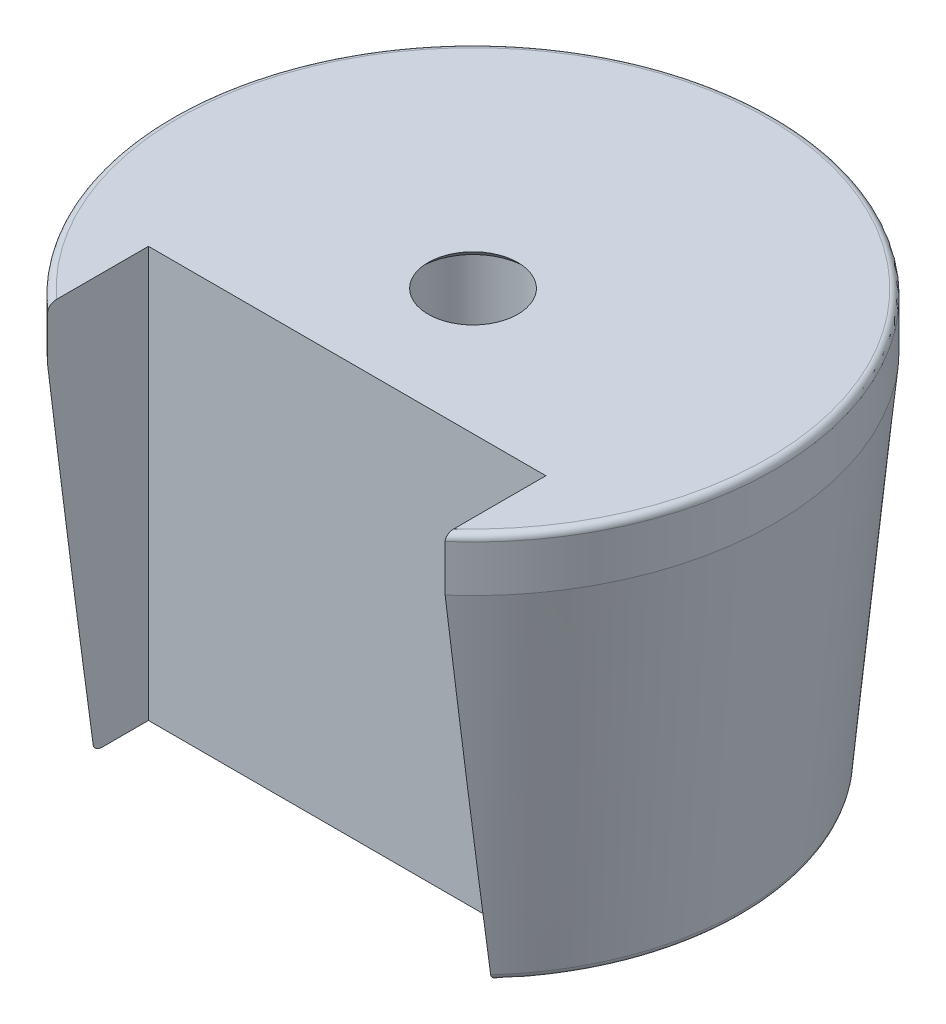
ISO-10303-21;
HEADER;
FILE_DESCRIPTION(('STEP AP214'),'2;1');
FILE_NAME('part.step','',(''),(''),'','','');
FILE_SCHEMA(('AUTOMOTIVE_DESIGN { 1 0 10303 214 1 1 1 1 }'));
ENDSEC;
DATA;
#1=APPLICATION_CONTEXT('core data for automotive mechanical design processes');
#2=APPLICATION_PROTOCOL_DEFINITION('international standard','automotive_design',2000,#1);
#3=PRODUCT_CONTEXT('',#1,'mechanical');
#4=PRODUCT('Part','Part','',(#3));
#5=PRODUCT_RELATED_PRODUCT_CATEGORY('part','',(#4));
#6=PRODUCT_DEFINITION_FORMATION('','',#4);
#7=PRODUCT_DEFINITION_CONTEXT('part definition',#1,'design');
#8=PRODUCT_DEFINITION('design','',#6,#7);
#9=PRODUCT_DEFINITION_SHAPE('','',#8);
#10=(LENGTH_UNIT() NAMED_UNIT(*) SI_UNIT(.MILLI.,.METRE.));
#11=(NAMED_UNIT(*) PLANE_ANGLE_UNIT() SI_UNIT($,.RADIAN.));
#12=(NAMED_UNIT(*) SI_UNIT($,.STERADIAN.) SOLID_ANGLE_UNIT());
#13=UNCERTAINTY_MEASURE_WITH_UNIT(LENGTH_MEASURE(1.E-05),#10,'distance_accuracy_value','');
#14=(GEOMETRIC_REPRESENTATION_CONTEXT(3) GLOBAL_UNCERTAINTY_ASSIGNED_CONTEXT((#13)) GLOBAL_UNIT_ASSIGNED_CONTEXT((#10,
#11,#12)) REPRESENTATION_CONTEXT('',''));
#15=CARTESIAN_POINT('',(0.,0.,0.));
#16=DIRECTION('',(0.,0.,1.));
#17=DIRECTION('',(1.,0.,0.));
#18=AXIS2_PLACEMENT_3D('',#15,#16,#17);
#19=CARTESIAN_POINT('',(0.,0.,-69.));
#20=DIRECTION('',(0.,1.,0.));
#21=DIRECTION('',(0.,0.,1.));
#22=AXIS2_PLACEMENT_3D('',#19,#20,#21);
#23=PLANE('',#22);
#24=CARTESIAN_POINT('',(0.,0.,-69.));
#25=DIRECTION('',(0.,-1.,0.));
#26=DIRECTION('',(0.,0.,-1.));
#27=AXIS2_PLACEMENT_3D('',#24,#25,#26);
#28=CIRCLE('',#27,8.);
#29=CARTESIAN_POINT('',(0.,0.,-77.));
#30=VERTEX_POINT('',#29);
#31=EDGE_CURVE('E20',#30,#30,#28,.F.);
#32=ORIENTED_EDGE('',*,*,#31,.T.);
#33=EDGE_LOOP('',(#32));
#34=FACE_BOUND('',#33,.T.);
#35=ADVANCED_FACE('F17',(#34),#23,.T.);
#36=CARTESIAN_POINT('',(0.,132.,-69.));
#37=DIRECTION('',(0.,-1.,0.));
#38=DIRECTION('',(0.,0.,-1.));
#39=AXIS2_PLACEMENT_3D('',#36,#37,#38);
#40=CYLINDRICAL_SURFACE('',#39,8.);
#41=ORIENTED_EDGE('',*,*,#31,.F.);
#42=EDGE_LOOP('',(#41));
#43=FACE_BOUND('',#42,.T.);
#44=CARTESIAN_POINT('',(0.,27.773,-69.));
#45=DIRECTION('',(0.,-1.,0.));
#46=DIRECTION('',(0.,0.,-1.));
#47=AXIS2_PLACEMENT_3D('',#44,#45,#46);
#48=CIRCLE('',#47,8.00000000000001);
#49=CARTESIAN_POINT('',(0.,27.773,-77.));
#50=VERTEX_POINT('',#49);
#51=EDGE_CURVE('E132',#50,#50,#48,.F.);
#52=ORIENTED_EDGE('',*,*,#51,.T.);
#53=EDGE_LOOP('',(#52));
#54=FACE_BOUND('',#53,.T.);
#55=ADVANCED_FACE('F168',(#43,#54),#40,.F.);
#56=CARTESIAN_POINT('',(0.,27.773,-69.));
#57=DIRECTION('',(0.,-1.,0.));
#58=DIRECTION('',(0.,0.,-1.));
#59=AXIS2_PLACEMENT_3D('',#56,#57,#58);
#60=CONICAL_SURFACE('',#59,8.00000000000001,0.7853981634);
#61=ORIENTED_EDGE('',*,*,#51,.F.);
#62=EDGE_LOOP('',(#61));
#63=FACE_BOUND('',#62,.T.);
#64=CARTESIAN_POINT('',(0.,28.9999999999969,-69.));
#65=DIRECTION('',(0.,-1.,0.));
#66=DIRECTION('',(0.,0.,-1.));
#67=AXIS2_PLACEMENT_3D('',#64,#65,#66);
#68=CIRCLE('',#67,6.77299999999688);
#69=CARTESIAN_POINT('',(0.,28.9999999999969,-75.7729999999969));
#70=VERTEX_POINT('',#69);
#71=EDGE_CURVE('E122',#70,#70,#68,.F.);
#72=ORIENTED_EDGE('',*,*,#71,.T.);
#73=EDGE_LOOP('',(#72));
#74=FACE_BOUND('',#73,.T.);
#75=ADVANCED_FACE('F166',(#63,#74),#60,.F.);
#76=CARTESIAN_POINT('',(0.,-33.,-69.));
#77=DIRECTION('',(0.,1.,0.));
#78=DIRECTION('',(0.,0.,1.));
#79=AXIS2_PLACEMENT_3D('',#76,#77,#78);
#80=PLANE('',#79);
#81=DIRECTION('',(1.,0.,0.));
#82=VECTOR('',#81,1.);
#83=CARTESIAN_POINT('',(-30.,-33.,-50.));
#84=LINE('',#83,#82);
#85=CARTESIAN_POINT('',(-30.,-33.,-50.));
#86=VERTEX_POINT('',#85);
#87=CARTESIAN_POINT('',(30.,-33.,-50.));
#88=VERTEX_POINT('',#87);
#89=EDGE_CURVE('E125',#86,#88,#84,.T.);
#90=ORIENTED_EDGE('',*,*,#89,.F.);
#91=DIRECTION('',(0.,0.,-1.));
#92=VECTOR('',#91,1.);
#93=CARTESIAN_POINT('',(-30.,-33.,-32.1727003433594));
#94=LINE('',#93,#92);
#95=CARTESIAN_POINT('',(-30.,-33.,-43.1691136761542));
#96=VERTEX_POINT('',#95);
#97=EDGE_CURVE('E213',#96,#86,#94,.T.);
#98=ORIENTED_EDGE('',*,*,#97,.F.);
#99=CARTESIAN_POINT('',(0.,-33.,-69.));
#100=DIRECTION('',(0.,1.,0.));
#101=DIRECTION('',(0.75779936489443,0.,0.652487641695686));
#102=AXIS2_PLACEMENT_3D('',#99,#100,#101);
#103=CIRCLE('',#102,39.5883150471884);
#104=CARTESIAN_POINT('',(30.,-33.,-43.1691136761542));
#105=VERTEX_POINT('',#104);
#106=EDGE_CURVE('E67',#105,#96,#103,.T.);
#107=ORIENTED_EDGE('',*,*,#106,.F.);
#108=DIRECTION('',(0.,0.,1.));
#109=VECTOR('',#108,1.);
#110=CARTESIAN_POINT('',(30.,-33.,-50.));
#111=LINE('',#110,#109);
#112=EDGE_CURVE('E63',#88,#105,#111,.T.);
#113=ORIENTED_EDGE('',*,*,#112,.F.);
#114=EDGE_LOOP('',(#90,#98,#107,#113));
#115=FACE_BOUND('',#114,.T.);
#116=ADVANCED_FACE('F155',(#115),#80,.F.);
#117=CARTESIAN_POINT('',(-30.,-103.,-50.));
#118=DIRECTION('',(0.,0.,1.));
#119=DIRECTION('',(1.,0.,0.));
#120=AXIS2_PLACEMENT_3D('',#117,#118,#119);
#121=PLANE('',#120);
#122=DIRECTION('',(1.,0.,0.));
#123=VECTOR('',#122,1.);
#124=CARTESIAN_POINT('',(0.,29.,-50.));
#125=LINE('',#124,#123);
#126=CARTESIAN_POINT('',(30.,29.,-50.));
#127=VERTEX_POINT('',#126);
#128=CARTESIAN_POINT('',(-30.,29.,-50.));
#129=VERTEX_POINT('',#128);
#130=EDGE_CURVE('E124',#127,#129,#125,.F.);
#131=ORIENTED_EDGE('',*,*,#130,.T.);
#132=DIRECTION('',(0.,1.,0.));
#133=VECTOR('',#132,1.);
#134=CARTESIAN_POINT('',(-30.,-103.,-50.));
#135=LINE('',#134,#133);
#136=EDGE_CURVE('E208',#86,#129,#135,.T.);
#137=ORIENTED_EDGE('',*,*,#136,.F.);
#138=ORIENTED_EDGE('',*,*,#89,.T.);
#139=DIRECTION('',(0.,1.,0.));
#140=VECTOR('',#139,1.);
#141=CARTESIAN_POINT('',(30.,-103.,-50.));
#142=LINE('',#141,#140);
#143=EDGE_CURVE('E68',#127,#88,#142,.F.);
#144=ORIENTED_EDGE('',*,*,#143,.F.);
#145=EDGE_LOOP('',(#131,#137,#138,#144));
#146=FACE_BOUND('',#145,.T.);
#147=ADVANCED_FACE('F165',(#146),#121,.T.);
#148=CARTESIAN_POINT('',(0.,29.,-24.5));
#149=DIRECTION('',(0.,-1.,0.));
#150=DIRECTION('',(0.,0.,-1.));
#151=AXIS2_PLACEMENT_3D('',#148,#149,#150);
#152=PLANE('',#151);
#153=CARTESIAN_POINT('',(0.,29.,-69.));
#154=DIRECTION('',(0.,-1.,0.));
#155=DIRECTION('',(-0.674157303370787,0.,0.738587794586283));
#156=AXIS2_PLACEMENT_3D('',#153,#154,#155);
#157=CIRCLE('',#156,44.5);
#158=CARTESIAN_POINT('',(-30.,29.,-36.1328431409104));
#159=VERTEX_POINT('',#158);
#160=CARTESIAN_POINT('',(30.,29.,-36.1328431409104));
#161=VERTEX_POINT('',#160);
#162=EDGE_CURVE('E129',#159,#161,#157,.T.);
#163=ORIENTED_EDGE('',*,*,#162,.F.);
#164=DIRECTION('',(0.,0.,-1.));
#165=VECTOR('',#164,1.);
#166=CARTESIAN_POINT('',(-30.,29.,-32.1727003433594));
#167=LINE('',#166,#165);
#168=EDGE_CURVE('E199',#129,#159,#167,.F.);
#169=ORIENTED_EDGE('',*,*,#168,.F.);
#170=ORIENTED_EDGE('',*,*,#130,.F.);
#171=DIRECTION('',(0.,0.,1.));
#172=VECTOR('',#171,1.);
#173=CARTESIAN_POINT('',(30.,29.,-50.));
#174=LINE('',#173,#172);
#175=EDGE_CURVE('E223',#161,#127,#174,.F.);
#176=ORIENTED_EDGE('',*,*,#175,.F.);
#177=EDGE_LOOP('',(#163,#169,#170,#176));
#178=FACE_BOUND('',#177,.T.);
#179=ORIENTED_EDGE('',*,*,#71,.F.);
#180=EDGE_LOOP('',(#179));
#181=FACE_BOUND('',#180,.T.);
#182=ADVANCED_FACE('F240',(#178,#181),#152,.F.);
#183=CARTESIAN_POINT('',(0.,28.,-69.));
#184=DIRECTION('',(0.,1.,0.));
#185=DIRECTION('',(0.,0.,1.));
#186=AXIS2_PLACEMENT_3D('',#183,#184,#185);
#187=TOROIDAL_SURFACE('',#186,44.5,1.);
#188=CARTESIAN_POINT('',(0.,28.,-69.));
#189=DIRECTION('',(0.,-1.,0.));
#190=DIRECTION('',(0.,0.,-1.));
#191=AXIS2_PLACEMENT_3D('',#188,#189,#190);
#192=CIRCLE('',#191,45.5);
#193=CARTESIAN_POINT('',(-30.,28.,-34.7910830338054));
#194=VERTEX_POINT('',#193);
#195=CARTESIAN_POINT('',(29.9999999999966,27.9999999999996,-34.7910830338024));
#196=VERTEX_POINT('',#195);
#197=EDGE_CURVE('E79',#194,#196,#192,.T.);
#198=ORIENTED_EDGE('',*,*,#197,.F.);
#199=CARTESIAN_POINT('',(-30.,29.,-36.1328431409104));
#200=CARTESIAN_POINT('',(-30.,28.999994699039,-36.090770046863));
#201=CARTESIAN_POINT('',(-30.,28.9985512945636,-36.0487118125855));
#202=CARTESIAN_POINT('',(-30.,28.9927404167335,-35.9647754733259));
#203=CARTESIAN_POINT('',(-30.,28.9883713501131,-35.9228974790127));
#204=CARTESIAN_POINT('',(-30.,28.9707299714245,-35.7972865382545));
#205=CARTESIAN_POINT('',(-30.,28.952922072243,-35.7141285912072));
#206=CARTESIAN_POINT('',(-30.,28.9066613043716,-35.5581860960697));
#207=CARTESIAN_POINT('',(-30.,28.8791948921305,-35.4851086145166));
#208=CARTESIAN_POINT('',(-30.,28.8130281576728,-35.3443138489954));
#209=CARTESIAN_POINT('',(-30.,28.7743577716275,-35.2765828853033));
#210=CARTESIAN_POINT('',(-30.,28.6959964204705,-35.1647155767337));
#211=CARTESIAN_POINT('',(-30.,28.658805740626,-35.118830646285));
#212=CARTESIAN_POINT('',(-30.,28.5775585158986,-35.03354723644));
#213=CARTESIAN_POINT('',(-30.,28.5335087088356,-34.9941424687699));
#214=CARTESIAN_POINT('',(-30.,28.4477319339724,-34.9305215485126));
#215=CARTESIAN_POINT('',(-30.,28.4070927925545,-34.9048437178047));
#216=CARTESIAN_POINT('',(-30.,28.3221679614721,-34.8605725654998));
#217=CARTESIAN_POINT('',(-30.,28.2778898131854,-34.8419650205197));
#218=CARTESIAN_POINT('',(-30.,28.1948771770221,-34.8155832820254));
#219=CARTESIAN_POINT('',(-30.,28.1565719863739,-34.8064649536283));
#220=CARTESIAN_POINT('',(-30.,28.0983418098442,-34.7972726505814));
#221=CARTESIAN_POINT('',(-30.,28.0787528876245,-34.794955952414));
#222=CARTESIAN_POINT('',(-30.,28.0394451461979,-34.7918597484161));
#223=CARTESIAN_POINT('',(-30.,28.0197262719392,-34.7910809425432));
#224=CARTESIAN_POINT('',(-30.,28.,-34.7910830338054));
#225=B_SPLINE_CURVE_WITH_KNOTS('',3,(#199,#200,#201,#202,#203,#204,#205,#206,#207,#208,#209,
#210,#211,#212,#213,#214,#215,#216,#217,#218,#219,#220,#221,#222,#223,#224),.UNSPECIFIED.,.F.,
.F.,(4,2,2,2,2,2,2,2,2,2,2,2,4),(0.,0.126163194364772,0.252395150989763,0.506500568161096,
0.73988501094566,0.972651529952376,1.14922299894128,1.32562210087289,1.46926209887924,
1.61261158501481,1.73026128365183,1.78938358749918,1.84853279412864),.UNSPECIFIED.);
#226=EDGE_CURVE('E198',#159,#194,#225,.T.);
#227=ORIENTED_EDGE('',*,*,#226,.F.);
#228=ORIENTED_EDGE('',*,*,#162,.T.);
#229=CARTESIAN_POINT('',(30.,27.9999999999993,-34.7910830338054));
#230=CARTESIAN_POINT('',(30.,28.023219080319,-34.7910796099138));
#231=CARTESIAN_POINT('',(30.,28.0464246622393,-34.7921595471501));
#232=CARTESIAN_POINT('',(30.,28.0926247535733,-34.7964435431699));
#233=CARTESIAN_POINT('',(30.,28.1156193852897,-34.7996462804074));
#234=CARTESIAN_POINT('',(30.,28.183685617882,-34.8123082980227));
#235=CARTESIAN_POINT('',(30.,28.228220238228,-34.8248229551708));
#236=CARTESIAN_POINT('',(30.,28.3143864871681,-34.857145739263));
#237=CARTESIAN_POINT('',(30.,28.3560240156549,-34.87693849471));
#238=CARTESIAN_POINT('',(30.,28.4357898265533,-34.9227352483435));
#239=CARTESIAN_POINT('',(30.,28.473911313529,-34.9487509388864));
#240=CARTESIAN_POINT('',(30.,28.5585778877721,-35.0156839819331));
#241=CARTESIAN_POINT('',(30.,28.6035042767118,-35.0586480240954));
#242=CARTESIAN_POINT('',(30.,28.6857818606307,-35.1512794206594));
#243=CARTESIAN_POINT('',(30.,28.7231212604717,-35.2009570156836));
#244=CARTESIAN_POINT('',(30.,28.8010197675875,-35.3216133294726));
#245=CARTESIAN_POINT('',(30.,28.8388464827731,-35.3943520336926));
#246=CARTESIAN_POINT('',(30.,28.9023142817057,-35.5450060400585));
#247=CARTESIAN_POINT('',(30.,28.9279310179498,-35.6229313350983));
#248=CARTESIAN_POINT('',(30.,28.96540702544,-35.7728065285784));
#249=CARTESIAN_POINT('',(30.,28.9784765653182,-35.8444612403803));
#250=CARTESIAN_POINT('',(30.,28.9957295365871,-35.988377211936));
#251=CARTESIAN_POINT('',(30.,28.9999691275427,-36.0606316855691));
#252=CARTESIAN_POINT('',(30.,29.,-36.1328431409104));
#253=B_SPLINE_CURVE_WITH_KNOTS('',3,(#229,#230,#231,#232,#233,#234,#235,#236,#237,#238,#239,
#240,#241,#242,#243,#244,#245,#246,#247,#248,#249,#250,#251,#252),.UNSPECIFIED.,.F.,.F.,(4,2,2,
2,2,2,2,2,2,2,2,4),(0.,0.0696063744699267,0.139169456242423,0.277170686845053,0.41488211447075,
0.552854351021148,0.738329870737327,0.92409157078637,1.16874736178055,1.41388899243111,
1.63185591517537,1.84843225443631),.UNSPECIFIED.);
#254=EDGE_CURVE('E121',#196,#161,#253,.T.);
#255=ORIENTED_EDGE('',*,*,#254,.F.);
#256=EDGE_LOOP('',(#198,#227,#228,#255));
#257=FACE_BOUND('',#256,.T.);
#258=ADVANCED_FACE('F102',(#257),#187,.T.);
#259=CARTESIAN_POINT('',(30.,-103.,-50.));
#260=DIRECTION('',(-1.,0.,0.));
#261=DIRECTION('',(0.,0.,1.));
#262=AXIS2_PLACEMENT_3D('',#259,#260,#261);
#263=PLANE('',#262);
#264=ORIENTED_EDGE('',*,*,#175,.T.);
#265=ORIENTED_EDGE('',*,*,#143,.T.);
#266=ORIENTED_EDGE('',*,*,#112,.T.);
#267=CARTESIAN_POINT('',(30.,-32.0921982105631,-41.6674995877437));
#268=CARTESIAN_POINT('',(30.,-32.1153148492188,-41.6706724038755));
#269=CARTESIAN_POINT('',(30.,-32.1382471536338,-41.6750370545797));
#270=CARTESIAN_POINT('',(30.,-32.183537808741,-41.6860056307577));
#271=CARTESIAN_POINT('',(30.,-32.2058969096515,-41.6926064496318));
#272=CARTESIAN_POINT('',(30.,-32.2714042237782,-41.7153921340706));
#273=CARTESIAN_POINT('',(30.,-32.3135131579625,-41.7346388065162));
#274=CARTESIAN_POINT('',(30.,-32.3936582911791,-41.7797060856419));
#275=CARTESIAN_POINT('',(30.,-32.4317145457441,-41.8054919577332));
#276=CARTESIAN_POINT('',(30.,-32.5038007094705,-41.8623189708156));
#277=CARTESIAN_POINT('',(30.,-32.5378180809716,-41.8933757846903));
#278=CARTESIAN_POINT('',(30.,-32.619663296046,-41.9780660574162));
#279=CARTESIAN_POINT('',(30.,-32.6645094169677,-42.0345789745013));
#280=CARTESIAN_POINT('',(30.,-32.7447665935915,-42.1539242844386));
#281=CARTESIAN_POINT('',(30.,-32.7801564348242,-42.216770457993));
#282=CARTESIAN_POINT('',(30.,-32.856633083542,-42.3763060422381));
#283=CARTESIAN_POINT('',(30.,-32.8928926697327,-42.4753013147442));
#284=CARTESIAN_POINT('',(30.,-32.9494080949265,-42.6776644403387));
#285=CARTESIAN_POINT('',(30.,-32.9696517558921,-42.7810355578961));
#286=CARTESIAN_POINT('',(30.,-32.9884412673558,-42.932407152528));
#287=CARTESIAN_POINT('',(30.,-32.9927986792669,-42.9797587187963));
#288=CARTESIAN_POINT('',(30.,-32.9985693503442,-43.0744411678512));
#289=CARTESIAN_POINT('',(30.,-32.9999949526137,-43.1217712951385));
#290=CARTESIAN_POINT('',(30.,-33.,-43.1691136761542));
#291=B_SPLINE_CURVE_WITH_KNOTS('',3,(#267,#268,#269,#270,#271,#272,#273,#274,#275,#276,#277,
#278,#279,#280,#281,#282,#283,#284,#285,#286,#287,#288,#289,#290),.UNSPECIFIED.,.F.,.F.,(4,2,2,
2,2,2,2,2,2,2,2,4),(0.,0.0699336962325508,0.139770632705259,0.277862130931044,0.415234947921708,
0.553023631590805,0.768244056457095,0.983943334103158,1.2985370886838,1.61336982180184,
1.75595042559587,1.89792951690144),.UNSPECIFIED.);
#292=CARTESIAN_POINT('',(30.,-32.0921982105599,-41.6674995877848));
#293=VERTEX_POINT('',#292);
#294=EDGE_CURVE('E52',#293,#105,#291,.T.);
#295=ORIENTED_EDGE('',*,*,#294,.F.);
#296=CARTESIAN_POINT('',(30.0000000001463,21.000000000292,-34.7910830360118));
#297=CARTESIAN_POINT('',(30.0000000000539,18.7860460116151,-35.0637431905373));
#298=CARTESIAN_POINT('',(30.0000000000148,16.5722632061278,-35.3377929581169));
#299=CARTESIAN_POINT('',(29.9999999999852,12.1450707212079,-35.8888959454871));
#300=CARTESIAN_POINT('',(29.9999999999949,9.93166104190826,-36.1659491663457));
#301=CARTESIAN_POINT('',(30.0000000000103,3.29209562420867,-37.0019430767922));
#302=CARTESIAN_POINT('',(30.0000000000027,-1.13345194396167,-37.5657248317881));
#303=CARTESIAN_POINT('',(29.9999999999973,-9.98261096955893,-38.7083955467994));
#304=CARTESIAN_POINT('',(29.9999999999995,-14.406222422347,-39.2872845428117));
#305=CARTESIAN_POINT('',(30.0000000000003,-21.0398760920584,-40.1690841928071));
#306=CARTESIAN_POINT('',(30.0000000000001,-23.2508136438562,-40.4652636301105));
#307=CARTESIAN_POINT('',(29.9999999999999,-27.6720232492078,-41.0625630772032));
#308=CARTESIAN_POINT('',(29.9999999999997,-29.8822953021273,-41.3636830916862));
#309=CARTESIAN_POINT('',(30.,-32.092198210552,-41.6674995878253));
#310=B_SPLINE_CURVE_WITH_KNOTS('',3,(#296,#297,#298,#299,#300,#301,#302,#303,#304,#305,#306,
#307,#308,#309),.UNSPECIFIED.,.F.,.F.,(4,2,2,2,2,2,4),(0.,6.69204102130711,13.3840844223346,
26.7680036224882,40.1519547161075,46.8440125048549,53.5360766516058),.UNSPECIFIED.);
#311=CARTESIAN_POINT('',(29.9999999999966,21.0000000002298,-34.7910830349386));
#312=VERTEX_POINT('',#311);
#313=EDGE_CURVE('E58',#312,#293,#310,.T.);
#314=ORIENTED_EDGE('',*,*,#313,.F.);
#315=DIRECTION('',(0.,-1.,0.));
#316=VECTOR('',#315,1.);
#317=CARTESIAN_POINT('',(29.9999999999931,132.,-34.7910830337993));
#318=LINE('',#317,#316);
#319=EDGE_CURVE('E207',#196,#312,#318,.T.);
#320=ORIENTED_EDGE('',*,*,#319,.F.);
#321=ORIENTED_EDGE('',*,*,#254,.T.);
#322=EDGE_LOOP('',(#264,#265,#266,#295,#314,#320,#321));
#323=FACE_BOUND('',#322,.T.);
#324=ADVANCED_FACE('F55',(#323),#263,.T.);
#325=CARTESIAN_POINT('',(0.,-32.,-69.));
#326=DIRECTION('',(0.,1.,0.));
#327=DIRECTION('',(0.,0.,1.));
#328=AXIS2_PLACEMENT_3D('',#325,#326,#327);
#329=TOROIDAL_SURFACE('',#328,39.5883150472,1.);
#330=ORIENTED_EDGE('',*,*,#106,.T.);
#331=CARTESIAN_POINT('',(-30.,-32.0921982105631,-41.6674995877437));
#332=CARTESIAN_POINT('',(-30.,-32.1153148492188,-41.6706724038755));
#333=CARTESIAN_POINT('',(-30.,-32.1382471536338,-41.6750370545797));
#334=CARTESIAN_POINT('',(-30.,-32.183537808741,-41.6860056307577));
#335=CARTESIAN_POINT('',(-30.,-32.2058969096515,-41.6926064496318));
#336=CARTESIAN_POINT('',(-30.,-32.2714042237782,-41.7153921340706));
#337=CARTESIAN_POINT('',(-30.,-32.3135131579625,-41.7346388065162));
#338=CARTESIAN_POINT('',(-30.,-32.3936582911791,-41.7797060856418));
#339=CARTESIAN_POINT('',(-30.,-32.4317145457441,-41.8054919577332));
#340=CARTESIAN_POINT('',(-30.,-32.5038007094705,-41.8623189708156));
#341=CARTESIAN_POINT('',(-30.,-32.5378180809716,-41.8933757846903));
#342=CARTESIAN_POINT('',(-30.,-32.619663296046,-41.9780660574162));
#343=CARTESIAN_POINT('',(-30.,-32.6645094169677,-42.0345789745013));
#344=CARTESIAN_POINT('',(-30.,-32.7447665935916,-42.1539242844386));
#345=CARTESIAN_POINT('',(-30.,-32.7801564348243,-42.216770457993));
#346=CARTESIAN_POINT('',(-30.,-32.856633083542,-42.3763060422382));
#347=CARTESIAN_POINT('',(-30.,-32.8928926697327,-42.4753013147442));
#348=CARTESIAN_POINT('',(-30.,-32.9494080949266,-42.6776644403388));
#349=CARTESIAN_POINT('',(-30.,-32.9696517558921,-42.7810355578961));
#350=CARTESIAN_POINT('',(-30.,-32.9884412673558,-42.932407152528));
#351=CARTESIAN_POINT('',(-30.,-32.9927986792669,-42.9797587187963));
#352=CARTESIAN_POINT('',(-30.,-32.9985693503442,-43.0744411678512));
#353=CARTESIAN_POINT('',(-30.,-32.9999949526137,-43.1217712951385));
#354=CARTESIAN_POINT('',(-30.,-33.,-43.1691136761542));
#355=B_SPLINE_CURVE_WITH_KNOTS('',3,(#331,#332,#333,#334,#335,#336,#337,#338,#339,#340,#341,
#342,#343,#344,#345,#346,#347,#348,#349,#350,#351,#352,#353,#354),.UNSPECIFIED.,.F.,.F.,(4,2,2,
2,2,2,2,2,2,2,2,4),(0.,0.0699336962325466,0.139770632705255,0.277862130931047,0.41523494792171,
0.553023631590806,0.768244056457107,0.983943334103169,1.29853708868382,1.61336982180187,
1.75595042559589,1.89792951690146),.UNSPECIFIED.);
#356=CARTESIAN_POINT('',(-30.,-32.0921982105575,-41.6674995877845));
#357=VERTEX_POINT('',#356);
#358=EDGE_CURVE('E74',#357,#96,#355,.T.);
#359=ORIENTED_EDGE('',*,*,#358,.F.);
#360=CARTESIAN_POINT('',(0.,-32.0921982105568,-69.));
#361=DIRECTION('',(0.,1.,0.));
#362=DIRECTION('',(0.,0.,1.));
#363=AXIS2_PLACEMENT_3D('',#360,#361,#362);
#364=CIRCLE('',#363,40.5840557212004);
#365=EDGE_CURVE('E71',#293,#357,#364,.T.);
#366=ORIENTED_EDGE('',*,*,#365,.F.);
#367=ORIENTED_EDGE('',*,*,#294,.T.);
#368=EDGE_LOOP('',(#330,#359,#366,#367));
#369=FACE_BOUND('',#368,.T.);
#370=ADVANCED_FACE('F72',(#369),#329,.T.);
#371=CARTESIAN_POINT('',(-30.,-103.,-32.1727003433594));
#372=DIRECTION('',(1.,0.,0.));
#373=DIRECTION('',(0.,0.,-1.));
#374=AXIS2_PLACEMENT_3D('',#371,#372,#373);
#375=PLANE('',#374);
#376=CARTESIAN_POINT('',(-30.0000000000088,-32.0921982105524,-41.6674995878219));
#377=CARTESIAN_POINT('',(-30.0000000000032,-29.8822953021274,-41.3636830916848));
#378=CARTESIAN_POINT('',(-30.0000000000009,-27.6720232492078,-41.0625630772028));
#379=CARTESIAN_POINT('',(-29.9999999999991,-23.250813643856,-40.4652636301109));
#380=CARTESIAN_POINT('',(-29.9999999999997,-21.0398760920582,-40.1690841928073));
#381=CARTESIAN_POINT('',(-30.0000000000006,-14.4062224223469,-39.2872845428112));
#382=CARTESIAN_POINT('',(-30.0000000000002,-9.98261096955894,-38.7083955467981));
#383=CARTESIAN_POINT('',(-29.9999999999998,-1.13345194396129,-37.5657248317893));
#384=CARTESIAN_POINT('',(-30.,3.29209562420951,-37.0019430767969));
#385=CARTESIAN_POINT('',(-30.,9.93166104190834,-36.1659491663433));
#386=CARTESIAN_POINT('',(-30.,12.1450707212075,-35.8888959454803));
#387=CARTESIAN_POINT('',(-30.,16.5722632061291,-35.3377929581235));
#388=CARTESIAN_POINT('',(-30.,18.7860460116187,-35.0637431905616));
#389=CARTESIAN_POINT('',(-30.,21.0000000003008,-34.7910830360779));
#390=B_SPLINE_CURVE_WITH_KNOTS('',3,(#376,#377,#378,#379,#380,#381,#382,#383,#384,#385,#386,
#387,#388,#389),.UNSPECIFIED.,.F.,.F.,(4,2,2,2,2,2,4),(0.,6.69206414675091,13.3841219354983,
26.7680730291176,40.1519922292714,46.844035630299,53.5360766516063),.UNSPECIFIED.);
#391=CARTESIAN_POINT('',(-30.,21.0000000094563,-34.7910830349503));
#392=VERTEX_POINT('',#391);
#393=EDGE_CURVE('E26',#357,#392,#390,.T.);
#394=ORIENTED_EDGE('',*,*,#393,.F.);
#395=ORIENTED_EDGE('',*,*,#358,.T.);
#396=ORIENTED_EDGE('',*,*,#97,.T.);
#397=ORIENTED_EDGE('',*,*,#136,.T.);
#398=ORIENTED_EDGE('',*,*,#168,.T.);
#399=ORIENTED_EDGE('',*,*,#226,.T.);
#400=DIRECTION('',(0.,-1.,0.));
#401=VECTOR('',#400,1.);
#402=CARTESIAN_POINT('',(-30.,132.,-34.7910830338054));
#403=LINE('',#402,#401);
#404=EDGE_CURVE('E35',#392,#194,#403,.F.);
#405=ORIENTED_EDGE('',*,*,#404,.F.);
#406=EDGE_LOOP('',(#394,#395,#396,#397,#398,#399,#405));
#407=FACE_BOUND('',#406,.T.);
#408=ADVANCED_FACE('F184',(#407),#375,.T.);
#409=CARTESIAN_POINT('',(0.,132.,-69.));
#410=DIRECTION('',(0.,-1.,0.));
#411=DIRECTION('',(0.,0.,-1.));
#412=AXIS2_PLACEMENT_3D('',#409,#410,#411);
#413=CYLINDRICAL_SURFACE('',#412,45.5);
#414=ORIENTED_EDGE('',*,*,#404,.T.);
#415=ORIENTED_EDGE('',*,*,#197,.T.);
#416=ORIENTED_EDGE('',*,*,#319,.T.);
#417=CARTESIAN_POINT('',(0.,21.0000000001594,-69.));
#418=DIRECTION('',(0.,1.,0.));
#419=DIRECTION('',(0.,0.,1.));
#420=AXIS2_PLACEMENT_3D('',#417,#418,#419);
#421=CIRCLE('',#420,45.4999999982783);
#422=EDGE_CURVE('E11',#392,#312,#421,.F.);
#423=ORIENTED_EDGE('',*,*,#422,.F.);
#424=EDGE_LOOP('',(#414,#415,#416,#423));
#425=FACE_BOUND('',#424,.T.);
#426=ADVANCED_FACE('F180',(#425),#413,.T.);
#427=CARTESIAN_POINT('',(0.,21.0000000001594,-69.));
#428=DIRECTION('',(0.,1.,0.));
#429=DIRECTION('',(0.,0.,1.));
#430=AXIS2_PLACEMENT_3D('',#427,#428,#429);
#431=CONICAL_SURFACE('',#430,45.4999999982784,0.0923293347000001);
#432=ORIENTED_EDGE('',*,*,#393,.T.);
#433=ORIENTED_EDGE('',*,*,#422,.T.);
#434=ORIENTED_EDGE('',*,*,#313,.T.);
#435=ORIENTED_EDGE('',*,*,#365,.T.);
#436=EDGE_LOOP('',(#432,#433,#434,#435));
#437=FACE_BOUND('',#436,.T.);
#438=ADVANCED_FACE('F78',(#437),#431,.T.);
#439=CLOSED_SHELL('',(#35,#55,#75,#116,#147,#182,#258,#324,#370,#408,#426,#438));
#440=MANIFOLD_SOLID_BREP('B1',#439);
#441=ADVANCED_BREP_SHAPE_REPRESENTATION('',(#18,#440),#14);
#442=SHAPE_DEFINITION_REPRESENTATION(#9,#441);
ENDSEC;
END-ISO-10303-21;
